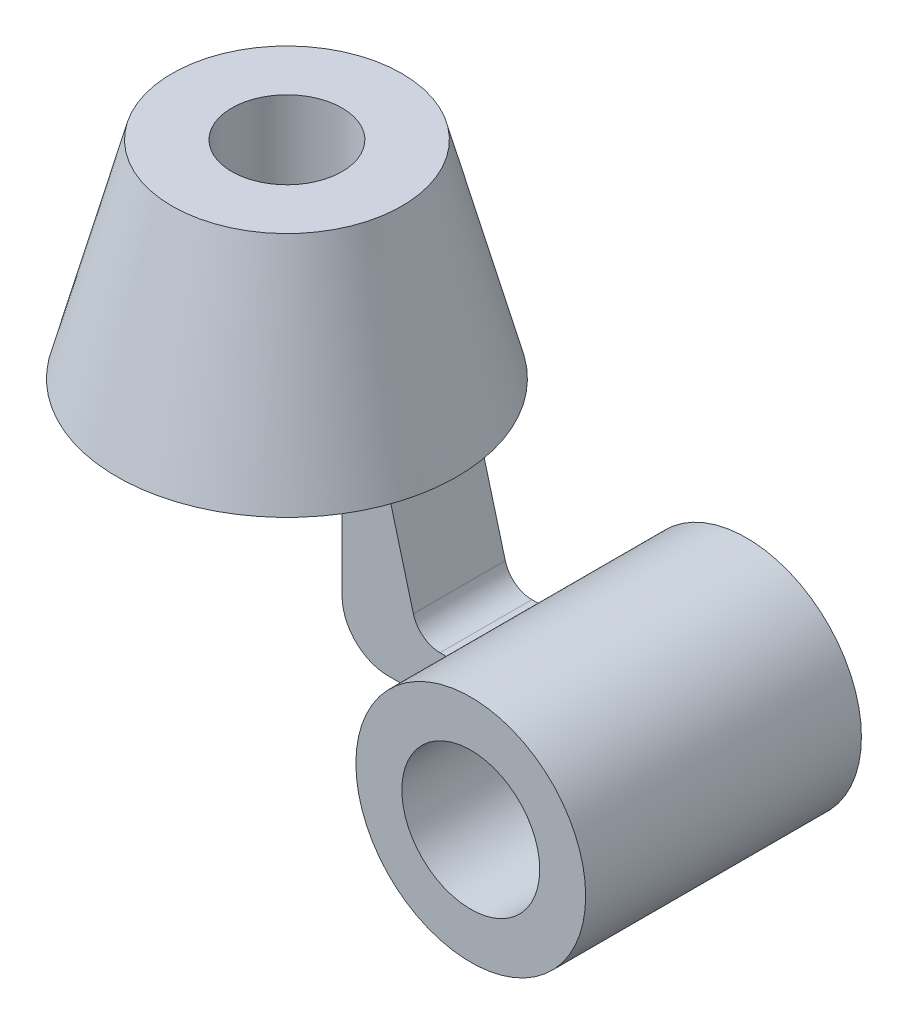
ISO-10303-21;
HEADER;
FILE_DESCRIPTION(('STEP AP214'),'2;1');
FILE_NAME('part.step','',(''),(''),'','','');
FILE_SCHEMA(('AUTOMOTIVE_DESIGN { 1 0 10303 214 1 1 1 1 }'));
ENDSEC;
DATA;
#1=APPLICATION_CONTEXT('core data for automotive mechanical design processes');
#2=APPLICATION_PROTOCOL_DEFINITION('international standard','automotive_design',2000,#1);
#3=PRODUCT_CONTEXT('',#1,'mechanical');
#4=PRODUCT('Part','Part','',(#3));
#5=PRODUCT_RELATED_PRODUCT_CATEGORY('part','',(#4));
#6=PRODUCT_DEFINITION_FORMATION('','',#4);
#7=PRODUCT_DEFINITION_CONTEXT('part definition',#1,'design');
#8=PRODUCT_DEFINITION('design','',#6,#7);
#9=PRODUCT_DEFINITION_SHAPE('','',#8);
#10=(LENGTH_UNIT() NAMED_UNIT(*) SI_UNIT(.MILLI.,.METRE.));
#11=(NAMED_UNIT(*) PLANE_ANGLE_UNIT() SI_UNIT($,.RADIAN.));
#12=(NAMED_UNIT(*) SI_UNIT($,.STERADIAN.) SOLID_ANGLE_UNIT());
#13=UNCERTAINTY_MEASURE_WITH_UNIT(LENGTH_MEASURE(1.E-05),#10,'distance_accuracy_value','');
#14=(GEOMETRIC_REPRESENTATION_CONTEXT(3) GLOBAL_UNCERTAINTY_ASSIGNED_CONTEXT((#13)) GLOBAL_UNIT_ASSIGNED_CONTEXT((#10,
#11,#12)) REPRESENTATION_CONTEXT('',''));
#15=CARTESIAN_POINT('',(0.,0.,0.));
#16=DIRECTION('',(0.,0.,1.));
#17=DIRECTION('',(1.,0.,0.));
#18=AXIS2_PLACEMENT_3D('',#15,#16,#17);
#19=CARTESIAN_POINT('',(70.,0.,30.));
#20=DIRECTION('',(0.,0.,-1.));
#21=DIRECTION('',(-1.,0.,0.));
#22=AXIS2_PLACEMENT_3D('',#19,#20,#21);
#23=CYLINDRICAL_SURFACE('',#22,15.);
#24=CARTESIAN_POINT('',(70.,0.,30.));
#25=DIRECTION('',(0.,0.,1.));
#26=DIRECTION('',(1.,0.,0.));
#27=AXIS2_PLACEMENT_3D('',#24,#25,#26);
#28=CIRCLE('',#27,15.);
#29=CARTESIAN_POINT('',(85.,0.,30.));
#30=VERTEX_POINT('',#29);
#31=EDGE_CURVE('E49',#30,#30,#28,.T.);
#32=ORIENTED_EDGE('',*,*,#31,.T.);
#33=EDGE_LOOP('',(#32));
#34=FACE_BOUND('',#33,.T.);
#35=CARTESIAN_POINT('',(70.,0.,-30.));
#36=DIRECTION('',(0.,0.,1.));
#37=DIRECTION('',(1.,0.,0.));
#38=AXIS2_PLACEMENT_3D('',#35,#36,#37);
#39=CIRCLE('',#38,15.);
#40=CARTESIAN_POINT('',(85.,0.,-30.));
#41=VERTEX_POINT('',#40);
#42=EDGE_CURVE('E144',#41,#41,#39,.T.);
#43=ORIENTED_EDGE('',*,*,#42,.F.);
#44=EDGE_LOOP('',(#43));
#45=FACE_BOUND('',#44,.T.);
#46=ADVANCED_FACE('F41',(#34,#45),#23,.F.);
#47=CARTESIAN_POINT('',(70.,0.,30.));
#48=DIRECTION('',(0.,0.,-1.));
#49=DIRECTION('',(-1.,0.,0.));
#50=AXIS2_PLACEMENT_3D('',#47,#48,#49);
#51=CYLINDRICAL_SURFACE('',#50,25.);
#52=DIRECTION('',(0.,0.,-1.));
#53=VECTOR('',#52,1.);
#54=CARTESIAN_POINT('',(47.0871215252208,10.,10.));
#55=LINE('',#54,#53);
#56=CARTESIAN_POINT('',(47.0871215252208,10.,10.));
#57=VERTEX_POINT('',#56);
#58=CARTESIAN_POINT('',(47.0871215252208,10.,-10.));
#59=VERTEX_POINT('',#58);
#60=EDGE_CURVE('E62',#57,#59,#55,.T.);
#61=ORIENTED_EDGE('',*,*,#60,.F.);
#62=CARTESIAN_POINT('',(70.,0.,10.));
#63=DIRECTION('',(0.,0.,1.));
#64=DIRECTION('',(1.,0.,0.));
#65=AXIS2_PLACEMENT_3D('',#62,#63,#64);
#66=CIRCLE('',#65,25.);
#67=CARTESIAN_POINT('',(45.,0.,10.));
#68=VERTEX_POINT('',#67);
#69=EDGE_CURVE('E57',#57,#68,#66,.T.);
#70=ORIENTED_EDGE('',*,*,#69,.T.);
#71=DIRECTION('',(0.,0.,-1.));
#72=VECTOR('',#71,1.);
#73=CARTESIAN_POINT('',(45.,0.,10.));
#74=LINE('',#73,#72);
#75=CARTESIAN_POINT('',(45.,0.,-10.));
#76=VERTEX_POINT('',#75);
#77=EDGE_CURVE('E140',#68,#76,#74,.T.);
#78=ORIENTED_EDGE('',*,*,#77,.T.);
#79=CARTESIAN_POINT('',(70.,0.,-10.));
#80=DIRECTION('',(0.,0.,1.));
#81=DIRECTION('',(1.,0.,0.));
#82=AXIS2_PLACEMENT_3D('',#79,#80,#81);
#83=CIRCLE('',#82,25.);
#84=EDGE_CURVE('E349',#59,#76,#83,.T.);
#85=ORIENTED_EDGE('',*,*,#84,.F.);
#86=EDGE_LOOP('',(#61,#70,#78,#85));
#87=FACE_BOUND('',#86,.T.);
#88=CARTESIAN_POINT('',(70.,0.,30.));
#89=DIRECTION('',(0.,0.,1.));
#90=DIRECTION('',(1.,0.,0.));
#91=AXIS2_PLACEMENT_3D('',#88,#89,#90);
#92=CIRCLE('',#91,25.);
#93=CARTESIAN_POINT('',(95.,0.,30.));
#94=VERTEX_POINT('',#93);
#95=EDGE_CURVE('E11',#94,#94,#92,.T.);
#96=ORIENTED_EDGE('',*,*,#95,.F.);
#97=EDGE_LOOP('',(#96));
#98=FACE_BOUND('',#97,.T.);
#99=CARTESIAN_POINT('',(70.,0.,-30.));
#100=DIRECTION('',(0.,0.,1.));
#101=DIRECTION('',(1.,0.,0.));
#102=AXIS2_PLACEMENT_3D('',#99,#100,#101);
#103=CIRCLE('',#102,25.);
#104=CARTESIAN_POINT('',(95.,0.,-30.));
#105=VERTEX_POINT('',#104);
#106=EDGE_CURVE('E44',#105,#105,#103,.T.);
#107=ORIENTED_EDGE('',*,*,#106,.T.);
#108=EDGE_LOOP('',(#107));
#109=FACE_BOUND('',#108,.T.);
#110=ADVANCED_FACE('F152',(#87,#98,#109),#51,.T.);
#111=CARTESIAN_POINT('',(0.,0.,30.));
#112=DIRECTION('',(0.,0.,1.));
#113=DIRECTION('',(1.,0.,0.));
#114=AXIS2_PLACEMENT_3D('',#111,#112,#113);
#115=PLANE('',#114);
#116=ORIENTED_EDGE('',*,*,#31,.F.);
#117=EDGE_LOOP('',(#116));
#118=FACE_BOUND('',#117,.T.);
#119=ORIENTED_EDGE('',*,*,#95,.T.);
#120=EDGE_LOOP('',(#119));
#121=FACE_BOUND('',#120,.T.);
#122=ADVANCED_FACE('F157',(#118,#121),#115,.T.);
#123=CARTESIAN_POINT('',(0.,0.,-30.));
#124=DIRECTION('',(0.,0.,1.));
#125=DIRECTION('',(1.,0.,0.));
#126=AXIS2_PLACEMENT_3D('',#123,#124,#125);
#127=PLANE('',#126);
#128=ORIENTED_EDGE('',*,*,#42,.T.);
#129=EDGE_LOOP('',(#128));
#130=FACE_BOUND('',#129,.T.);
#131=ORIENTED_EDGE('',*,*,#106,.F.);
#132=EDGE_LOOP('',(#131));
#133=FACE_BOUND('',#132,.T.);
#134=ADVANCED_FACE('F154',(#130,#133),#127,.F.);
#135=CARTESIAN_POINT('',(32.,10.,10.));
#136=DIRECTION('',(0.,0.,-1.));
#137=DIRECTION('',(-1.,0.,0.));
#138=AXIS2_PLACEMENT_3D('',#135,#136,#137);
#139=CYLINDRICAL_SURFACE('',#138,10.);
#140=CARTESIAN_POINT('',(32.,10.,-10.));
#141=DIRECTION('',(0.,0.,1.));
#142=DIRECTION('',(1.,0.,0.));
#143=AXIS2_PLACEMENT_3D('',#140,#141,#142);
#144=CIRCLE('',#143,10.);
#145=CARTESIAN_POINT('',(32.0000000000001,0.,-10.));
#146=VERTEX_POINT('',#145);
#147=CARTESIAN_POINT('',(22.,10.0000000000001,-10.));
#148=VERTEX_POINT('',#147);
#149=EDGE_CURVE('E325',#146,#148,#144,.F.);
#150=ORIENTED_EDGE('',*,*,#149,.F.);
#151=DIRECTION('',(0.,0.,-1.));
#152=VECTOR('',#151,1.);
#153=CARTESIAN_POINT('',(32.0000000000001,0.,10.));
#154=LINE('',#153,#152);
#155=CARTESIAN_POINT('',(32.0000000000001,0.,10.));
#156=VERTEX_POINT('',#155);
#157=EDGE_CURVE('E142',#156,#146,#154,.T.);
#158=ORIENTED_EDGE('',*,*,#157,.F.);
#159=CARTESIAN_POINT('',(32.,10.,10.));
#160=DIRECTION('',(0.,0.,1.));
#161=DIRECTION('',(1.,0.,0.));
#162=AXIS2_PLACEMENT_3D('',#159,#160,#161);
#163=CIRCLE('',#162,10.);
#164=CARTESIAN_POINT('',(22.,10.0000000000001,10.));
#165=VERTEX_POINT('',#164);
#166=EDGE_CURVE('E326',#156,#165,#163,.F.);
#167=ORIENTED_EDGE('',*,*,#166,.T.);
#168=DIRECTION('',(0.,0.,-1.));
#169=VECTOR('',#168,1.);
#170=CARTESIAN_POINT('',(22.,10.0000000000001,10.));
#171=LINE('',#170,#169);
#172=EDGE_CURVE('E134',#165,#148,#171,.T.);
#173=ORIENTED_EDGE('',*,*,#172,.T.);
#174=EDGE_LOOP('',(#150,#158,#167,#173));
#175=FACE_BOUND('',#174,.T.);
#176=ADVANCED_FACE('F156',(#175),#139,.T.);
#177=CARTESIAN_POINT('',(0.,0.,10.));
#178=DIRECTION('',(0.,-1.,0.));
#179=DIRECTION('',(1.,0.,0.));
#180=AXIS2_PLACEMENT_3D('',#177,#178,#179);
#181=PLANE('',#180);
#182=DIRECTION('',(-1.,0.,0.));
#183=VECTOR('',#182,1.);
#184=CARTESIAN_POINT('',(0.,0.,-10.));
#185=LINE('',#184,#183);
#186=EDGE_CURVE('E346',#76,#146,#185,.T.);
#187=ORIENTED_EDGE('',*,*,#186,.F.);
#188=ORIENTED_EDGE('',*,*,#77,.F.);
#189=DIRECTION('',(-1.,0.,0.));
#190=VECTOR('',#189,1.);
#191=CARTESIAN_POINT('',(0.,0.,10.));
#192=LINE('',#191,#190);
#193=EDGE_CURVE('E329',#68,#156,#192,.T.);
#194=ORIENTED_EDGE('',*,*,#193,.T.);
#195=ORIENTED_EDGE('',*,*,#157,.T.);
#196=EDGE_LOOP('',(#187,#188,#194,#195));
#197=FACE_BOUND('',#196,.T.);
#198=ADVANCED_FACE('F164',(#197),#181,.T.);
#199=CARTESIAN_POINT('',(0.,10.,10.));
#200=DIRECTION('',(0.,1.,0.));
#201=DIRECTION('',(0.,0.,1.));
#202=AXIS2_PLACEMENT_3D('',#199,#200,#201);
#203=PLANE('',#202);
#204=DIRECTION('',(1.,0.,0.));
#205=VECTOR('',#204,1.);
#206=CARTESIAN_POINT('',(0.,10.,-10.));
#207=LINE('',#206,#205);
#208=CARTESIAN_POINT('',(43.3026917386517,10.,-10.));
#209=VERTEX_POINT('',#208);
#210=EDGE_CURVE('E352',#209,#59,#207,.T.);
#211=ORIENTED_EDGE('',*,*,#210,.F.);
#212=DIRECTION('',(0.,0.,-1.));
#213=VECTOR('',#212,1.);
#214=CARTESIAN_POINT('',(43.3026917386517,10.,10.));
#215=LINE('',#214,#213);
#216=CARTESIAN_POINT('',(43.3026917386517,10.,10.));
#217=VERTEX_POINT('',#216);
#218=EDGE_CURVE('E132',#217,#209,#215,.T.);
#219=ORIENTED_EDGE('',*,*,#218,.F.);
#220=DIRECTION('',(1.,0.,0.));
#221=VECTOR('',#220,1.);
#222=CARTESIAN_POINT('',(0.,10.,10.));
#223=LINE('',#222,#221);
#224=EDGE_CURVE('E333',#217,#57,#223,.T.);
#225=ORIENTED_EDGE('',*,*,#224,.T.);
#226=ORIENTED_EDGE('',*,*,#60,.T.);
#227=EDGE_LOOP('',(#211,#219,#225,#226));
#228=FACE_BOUND('',#227,.T.);
#229=ADVANCED_FACE('F193',(#228),#203,.T.);
#230=CARTESIAN_POINT('',(43.3026917386517,16.,10.));
#231=DIRECTION('',(0.,0.,-1.));
#232=DIRECTION('',(-1.,0.,0.));
#233=AXIS2_PLACEMENT_3D('',#230,#231,#232);
#234=CYLINDRICAL_SURFACE('',#233,6.);
#235=CARTESIAN_POINT('',(43.3026917386517,16.,-10.));
#236=DIRECTION('',(0.,0.,1.));
#237=DIRECTION('',(1.,0.,0.));
#238=AXIS2_PLACEMENT_3D('',#235,#236,#237);
#239=CIRCLE('',#238,6.);
#240=CARTESIAN_POINT('',(37.5071367809173,14.4470857293849,-10.));
#241=VERTEX_POINT('',#240);
#242=EDGE_CURVE('E125',#241,#209,#239,.T.);
#243=ORIENTED_EDGE('',*,*,#242,.F.);
#244=DIRECTION('',(0.,0.,-1.));
#245=VECTOR('',#244,1.);
#246=CARTESIAN_POINT('',(37.5071367809173,14.4470857293849,10.));
#247=LINE('',#246,#245);
#248=CARTESIAN_POINT('',(37.5071367809173,14.4470857293849,10.));
#249=VERTEX_POINT('',#248);
#250=EDGE_CURVE('E123',#249,#241,#247,.T.);
#251=ORIENTED_EDGE('',*,*,#250,.F.);
#252=CARTESIAN_POINT('',(43.3026917386517,16.,10.));
#253=DIRECTION('',(0.,0.,1.));
#254=DIRECTION('',(1.,0.,0.));
#255=AXIS2_PLACEMENT_3D('',#252,#253,#254);
#256=CIRCLE('',#255,6.);
#257=EDGE_CURVE('E336',#249,#217,#256,.T.);
#258=ORIENTED_EDGE('',*,*,#257,.T.);
#259=ORIENTED_EDGE('',*,*,#218,.T.);
#260=EDGE_LOOP('',(#243,#251,#258,#259));
#261=FACE_BOUND('',#260,.T.);
#262=ADVANCED_FACE('F202',(#261),#234,.F.);
#263=CARTESIAN_POINT('',(38.6064064605509,10.344555433772,10.));
#264=DIRECTION('',(0.96592582628907,0.258819045102515,0.));
#265=DIRECTION('',(-0.258819045102515,0.96592582628907,0.));
#266=AXIS2_PLACEMENT_3D('',#263,#264,#265);
#267=PLANE('',#266);
#268=DIRECTION('',(0.258819045102515,-0.96592582628907,0.));
#269=VECTOR('',#268,1.);
#270=CARTESIAN_POINT('',(38.6064064605509,10.344555433772,-10.));
#271=LINE('',#270,#269);
#272=CARTESIAN_POINT('',(32.,35.,-10.));
#273=VERTEX_POINT('',#272);
#274=EDGE_CURVE('E111',#273,#241,#271,.T.);
#275=ORIENTED_EDGE('',*,*,#274,.F.);
#276=DIRECTION('',(0.,0.,-1.));
#277=VECTOR('',#276,1.);
#278=CARTESIAN_POINT('',(32.,35.,10.));
#279=LINE('',#278,#277);
#280=CARTESIAN_POINT('',(32.,35.,10.));
#281=VERTEX_POINT('',#280);
#282=EDGE_CURVE('E121',#281,#273,#279,.T.);
#283=ORIENTED_EDGE('',*,*,#282,.F.);
#284=DIRECTION('',(0.258819045102515,-0.96592582628907,0.));
#285=VECTOR('',#284,1.);
#286=CARTESIAN_POINT('',(38.6064064605509,10.344555433772,10.));
#287=LINE('',#286,#285);
#288=EDGE_CURVE('E339',#281,#249,#287,.T.);
#289=ORIENTED_EDGE('',*,*,#288,.T.);
#290=ORIENTED_EDGE('',*,*,#250,.T.);
#291=EDGE_LOOP('',(#275,#283,#289,#290));
#292=FACE_BOUND('',#291,.T.);
#293=ADVANCED_FACE('F119',(#292),#267,.T.);
#294=CARTESIAN_POINT('',(22.,0.,10.));
#295=DIRECTION('',(-1.,0.,0.));
#296=DIRECTION('',(0.,0.,1.));
#297=AXIS2_PLACEMENT_3D('',#294,#295,#296);
#298=PLANE('',#297);
#299=DIRECTION('',(0.,1.,0.));
#300=VECTOR('',#299,1.);
#301=CARTESIAN_POINT('',(22.,0.,-10.));
#302=LINE('',#301,#300);
#303=CARTESIAN_POINT('',(22.,35.,-10.));
#304=VERTEX_POINT('',#303);
#305=EDGE_CURVE('E113',#148,#304,#302,.T.);
#306=ORIENTED_EDGE('',*,*,#305,.F.);
#307=ORIENTED_EDGE('',*,*,#172,.F.);
#308=DIRECTION('',(0.,1.,0.));
#309=VECTOR('',#308,1.);
#310=CARTESIAN_POINT('',(22.,0.,10.));
#311=LINE('',#310,#309);
#312=CARTESIAN_POINT('',(22.,35.,10.));
#313=VERTEX_POINT('',#312);
#314=EDGE_CURVE('E342',#165,#313,#311,.T.);
#315=ORIENTED_EDGE('',*,*,#314,.T.);
#316=DIRECTION('',(0.,0.,-1.));
#317=VECTOR('',#316,1.);
#318=CARTESIAN_POINT('',(22.,35.,10.));
#319=LINE('',#318,#317);
#320=EDGE_CURVE('E130',#313,#304,#319,.T.);
#321=ORIENTED_EDGE('',*,*,#320,.T.);
#322=EDGE_LOOP('',(#306,#307,#315,#321));
#323=FACE_BOUND('',#322,.T.);
#324=ADVANCED_FACE('F219',(#323),#298,.T.);
#325=CARTESIAN_POINT('',(0.,0.,10.));
#326=DIRECTION('',(0.,0.,1.));
#327=DIRECTION('',(1.,0.,0.));
#328=AXIS2_PLACEMENT_3D('',#325,#326,#327);
#329=PLANE('',#328);
#330=ORIENTED_EDGE('',*,*,#166,.F.);
#331=ORIENTED_EDGE('',*,*,#193,.F.);
#332=ORIENTED_EDGE('',*,*,#69,.F.);
#333=ORIENTED_EDGE('',*,*,#224,.F.);
#334=ORIENTED_EDGE('',*,*,#257,.F.);
#335=ORIENTED_EDGE('',*,*,#288,.F.);
#336=DIRECTION('',(1.,0.,0.));
#337=VECTOR('',#336,1.);
#338=CARTESIAN_POINT('',(0.,35.,10.));
#339=LINE('',#338,#337);
#340=EDGE_CURVE('E129',#313,#281,#339,.T.);
#341=ORIENTED_EDGE('',*,*,#340,.F.);
#342=ORIENTED_EDGE('',*,*,#314,.F.);
#343=EDGE_LOOP('',(#330,#331,#332,#333,#334,#335,#341,#342));
#344=FACE_BOUND('',#343,.T.);
#345=ADVANCED_FACE('F227',(#344),#329,.T.);
#346=CARTESIAN_POINT('',(0.,0.,-10.));
#347=DIRECTION('',(0.,0.,1.));
#348=DIRECTION('',(1.,0.,0.));
#349=AXIS2_PLACEMENT_3D('',#346,#347,#348);
#350=PLANE('',#349);
#351=ORIENTED_EDGE('',*,*,#149,.T.);
#352=ORIENTED_EDGE('',*,*,#305,.T.);
#353=DIRECTION('',(1.,0.,0.));
#354=VECTOR('',#353,1.);
#355=CARTESIAN_POINT('',(0.,35.,-10.));
#356=LINE('',#355,#354);
#357=EDGE_CURVE('E106',#304,#273,#356,.T.);
#358=ORIENTED_EDGE('',*,*,#357,.T.);
#359=ORIENTED_EDGE('',*,*,#274,.T.);
#360=ORIENTED_EDGE('',*,*,#242,.T.);
#361=ORIENTED_EDGE('',*,*,#210,.T.);
#362=ORIENTED_EDGE('',*,*,#84,.T.);
#363=ORIENTED_EDGE('',*,*,#186,.T.);
#364=EDGE_LOOP('',(#351,#352,#358,#359,#360,#361,#362,#363));
#365=FACE_BOUND('',#364,.T.);
#366=ADVANCED_FACE('F109',(#365),#350,.F.);
#367=CARTESIAN_POINT('',(12.,35.,0.));
#368=DIRECTION('',(0.,-1.,0.));
#369=DIRECTION('',(0.,0.,-1.));
#370=AXIS2_PLACEMENT_3D('',#367,#368,#369);
#371=PLANE('',#370);
#372=CARTESIAN_POINT('',(0.,35.,0.));
#373=DIRECTION('',(0.,-1.,0.));
#374=DIRECTION('',(0.,0.,-1.));
#375=AXIS2_PLACEMENT_3D('',#372,#373,#374);
#376=CIRCLE('',#375,12.);
#377=CARTESIAN_POINT('',(0.,35.,-12.));
#378=VERTEX_POINT('',#377);
#379=EDGE_CURVE('E316',#378,#378,#376,.T.);
#380=ORIENTED_EDGE('',*,*,#379,.F.);
#381=EDGE_LOOP('',(#380));
#382=FACE_BOUND('',#381,.T.);
#383=CARTESIAN_POINT('',(0.,35.,0.));
#384=DIRECTION('',(0.,-1.,0.));
#385=DIRECTION('',(0.,0.,-1.));
#386=AXIS2_PLACEMENT_3D('',#383,#384,#385);
#387=CIRCLE('',#386,37.);
#388=CARTESIAN_POINT('',(0.,35.,-37.));
#389=VERTEX_POINT('',#388);
#390=EDGE_CURVE('E314',#389,#389,#387,.T.);
#391=ORIENTED_EDGE('',*,*,#390,.T.);
#392=EDGE_LOOP('',(#391));
#393=FACE_BOUND('',#392,.T.);
#394=ORIENTED_EDGE('',*,*,#357,.F.);
#395=ORIENTED_EDGE('',*,*,#320,.F.);
#396=ORIENTED_EDGE('',*,*,#340,.T.);
#397=ORIENTED_EDGE('',*,*,#282,.T.);
#398=EDGE_LOOP('',(#394,#395,#396,#397));
#399=FACE_BOUND('',#398,.T.);
#400=ADVANCED_FACE('F128',(#382,#393,#399),#371,.T.);
#401=CARTESIAN_POINT('',(25.,80.,0.));
#402=DIRECTION('',(0.,1.,0.));
#403=DIRECTION('',(0.,0.,1.));
#404=AXIS2_PLACEMENT_3D('',#401,#402,#403);
#405=PLANE('',#404);
#406=CARTESIAN_POINT('',(0.,80.,0.));
#407=DIRECTION('',(0.,-1.,0.));
#408=DIRECTION('',(0.,0.,-1.));
#409=AXIS2_PLACEMENT_3D('',#406,#407,#408);
#410=CIRCLE('',#409,12.);
#411=CARTESIAN_POINT('',(0.,80.,-12.));
#412=VERTEX_POINT('',#411);
#413=EDGE_CURVE('E319',#412,#412,#410,.T.);
#414=ORIENTED_EDGE('',*,*,#413,.T.);
#415=EDGE_LOOP('',(#414));
#416=FACE_BOUND('',#415,.T.);
#417=CARTESIAN_POINT('',(0.,80.,0.));
#418=DIRECTION('',(0.,-1.,0.));
#419=DIRECTION('',(0.,0.,-1.));
#420=AXIS2_PLACEMENT_3D('',#417,#418,#419);
#421=CIRCLE('',#420,25.);
#422=CARTESIAN_POINT('',(0.,80.,-25.));
#423=VERTEX_POINT('',#422);
#424=EDGE_CURVE('E311',#423,#423,#421,.T.);
#425=ORIENTED_EDGE('',*,*,#424,.F.);
#426=EDGE_LOOP('',(#425));
#427=FACE_BOUND('',#426,.T.);
#428=ADVANCED_FACE('F251',(#416,#427),#405,.T.);
#429=CARTESIAN_POINT('',(0.,35.,0.));
#430=DIRECTION('',(0.,-1.,0.));
#431=DIRECTION('',(0.,0.,-1.));
#432=AXIS2_PLACEMENT_3D('',#429,#430,#431);
#433=CYLINDRICAL_SURFACE('',#432,12.);
#434=ORIENTED_EDGE('',*,*,#379,.T.);
#435=EDGE_LOOP('',(#434));
#436=FACE_BOUND('',#435,.T.);
#437=ORIENTED_EDGE('',*,*,#413,.F.);
#438=EDGE_LOOP('',(#437));
#439=FACE_BOUND('',#438,.T.);
#440=ADVANCED_FACE('F260',(#436,#439),#433,.F.);
#441=CARTESIAN_POINT('',(0.,35.,0.));
#442=DIRECTION('',(0.,-1.,0.));
#443=DIRECTION('',(0.,0.,-1.));
#444=AXIS2_PLACEMENT_3D('',#441,#442,#443);
#445=CONICAL_SURFACE('',#444,37.,0.260602391747341);
#446=ORIENTED_EDGE('',*,*,#424,.T.);
#447=EDGE_LOOP('',(#446));
#448=FACE_BOUND('',#447,.T.);
#449=ORIENTED_EDGE('',*,*,#390,.F.);
#450=EDGE_LOOP('',(#449));
#451=FACE_BOUND('',#450,.T.);
#452=ADVANCED_FACE('F269',(#448,#451),#445,.T.);
#453=CLOSED_SHELL('',(#46,#110,#122,#134,#176,#198,#229,#262,#293,#324,#345,#366,#400,#428,#440,#452));
#454=MANIFOLD_SOLID_BREP('B2',#453);
#455=ADVANCED_BREP_SHAPE_REPRESENTATION('',(#18,#454),#14);
#456=SHAPE_DEFINITION_REPRESENTATION(#9,#455);
ENDSEC;
END-ISO-10303-21;
